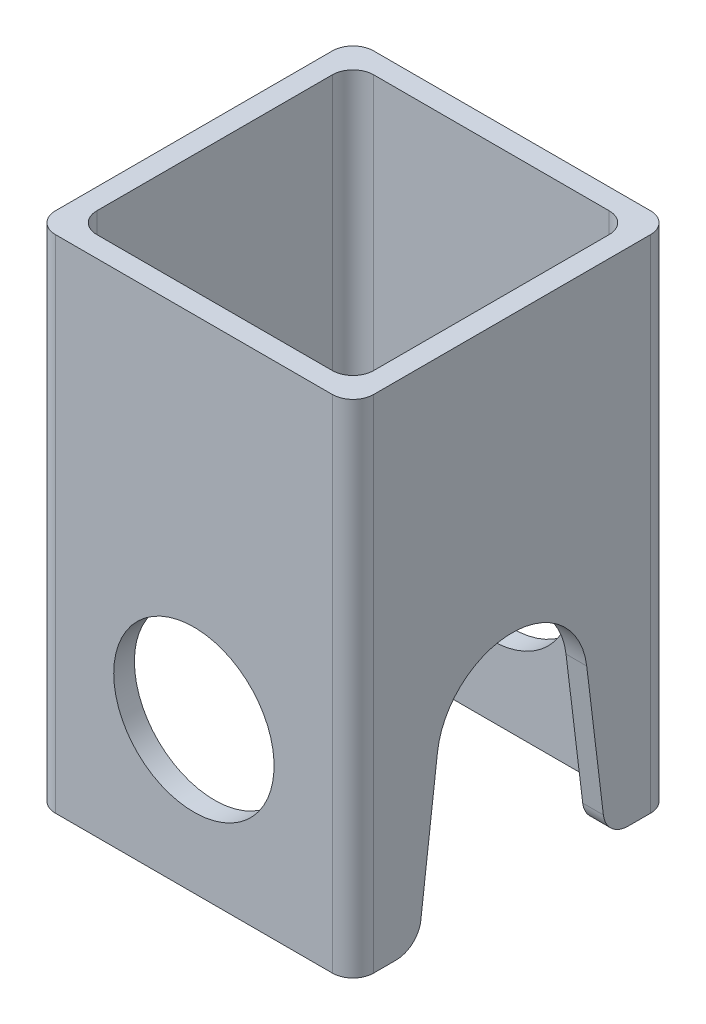
ISO-10303-21;
HEADER;
FILE_DESCRIPTION(('STEP AP214'),'2;1');
FILE_NAME('part.step','',(''),(''),'','','');
FILE_SCHEMA(('AUTOMOTIVE_DESIGN { 1 0 10303 214 1 1 1 1 }'));
ENDSEC;
DATA;
#1=APPLICATION_CONTEXT('core data for automotive mechanical design processes');
#2=APPLICATION_PROTOCOL_DEFINITION('international standard','automotive_design',2000,#1);
#3=PRODUCT_CONTEXT('',#1,'mechanical');
#4=PRODUCT('Part','Part','',(#3));
#5=PRODUCT_RELATED_PRODUCT_CATEGORY('part','',(#4));
#6=PRODUCT_DEFINITION_FORMATION('','',#4);
#7=PRODUCT_DEFINITION_CONTEXT('part definition',#1,'design');
#8=PRODUCT_DEFINITION('design','',#6,#7);
#9=PRODUCT_DEFINITION_SHAPE('','',#8);
#10=(LENGTH_UNIT() NAMED_UNIT(*) SI_UNIT(.MILLI.,.METRE.));
#11=(NAMED_UNIT(*) PLANE_ANGLE_UNIT() SI_UNIT($,.RADIAN.));
#12=(NAMED_UNIT(*) SI_UNIT($,.STERADIAN.) SOLID_ANGLE_UNIT());
#13=UNCERTAINTY_MEASURE_WITH_UNIT(LENGTH_MEASURE(1.E-05),#10,'distance_accuracy_value','');
#14=(GEOMETRIC_REPRESENTATION_CONTEXT(3) GLOBAL_UNCERTAINTY_ASSIGNED_CONTEXT((#13)) GLOBAL_UNIT_ASSIGNED_CONTEXT((#10,
#11,#12)) REPRESENTATION_CONTEXT('',''));
#15=CARTESIAN_POINT('',(0.,0.,0.));
#16=DIRECTION('',(0.,0.,1.));
#17=DIRECTION('',(1.,0.,0.));
#18=AXIS2_PLACEMENT_3D('',#15,#16,#17);
#19=CARTESIAN_POINT('',(-11.049,0.,-11.049));
#20=DIRECTION('',(0.,-1.,0.));
#21=DIRECTION('',(0.,0.,-1.));
#22=AXIS2_PLACEMENT_3D('',#19,#20,#21);
#23=PLANE('',#22);
#24=DIRECTION('',(0.,0.,1.));
#25=VECTOR('',#24,1.);
#26=CARTESIAN_POINT('',(-11.049,0.,-9.39799999999999));
#27=LINE('',#26,#25);
#28=CARTESIAN_POINT('',(-11.049,0.,-9.39799999999999));
#29=VERTEX_POINT('',#28);
#30=CARTESIAN_POINT('',(-11.049,0.,-9.27200187265877));
#31=VERTEX_POINT('',#30);
#32=EDGE_CURVE('E442',#29,#31,#27,.T.);
#33=ORIENTED_EDGE('',*,*,#32,.T.);
#34=DIRECTION('',(1.,0.,0.));
#35=VECTOR('',#34,1.);
#36=CARTESIAN_POINT('',(-12.7,0.,-9.27200187265877));
#37=LINE('',#36,#35);
#38=CARTESIAN_POINT('',(-12.7,0.,-9.27200187265877));
#39=VERTEX_POINT('',#38);
#40=EDGE_CURVE('E537',#31,#39,#37,.F.);
#41=ORIENTED_EDGE('',*,*,#40,.T.);
#42=DIRECTION('',(0.,0.,1.));
#43=VECTOR('',#42,1.);
#44=CARTESIAN_POINT('',(-12.7,0.,11.049));
#45=LINE('',#44,#43);
#46=CARTESIAN_POINT('',(-12.7,0.,-11.049));
#47=VERTEX_POINT('',#46);
#48=EDGE_CURVE('E406',#47,#39,#45,.T.);
#49=ORIENTED_EDGE('',*,*,#48,.F.);
#50=CARTESIAN_POINT('',(-11.049,0.,-11.049));
#51=DIRECTION('',(0.,1.,0.));
#52=DIRECTION('',(0.,0.,-1.));
#53=AXIS2_PLACEMENT_3D('',#50,#51,#52);
#54=CIRCLE('',#53,1.651);
#55=CARTESIAN_POINT('',(-11.049,0.,-12.7));
#56=VERTEX_POINT('',#55);
#57=EDGE_CURVE('E342',#56,#47,#54,.T.);
#58=ORIENTED_EDGE('',*,*,#57,.F.);
#59=DIRECTION('',(-1.,0.,0.));
#60=VECTOR('',#59,1.);
#61=CARTESIAN_POINT('',(11.049,0.,-12.7));
#62=LINE('',#61,#60);
#63=CARTESIAN_POINT('',(11.049,0.,-12.7));
#64=VERTEX_POINT('',#63);
#65=EDGE_CURVE('E426',#64,#56,#62,.T.);
#66=ORIENTED_EDGE('',*,*,#65,.F.);
#67=CARTESIAN_POINT('',(11.049,0.,-11.049));
#68=DIRECTION('',(0.,1.,0.));
#69=DIRECTION('',(0.,0.,1.));
#70=AXIS2_PLACEMENT_3D('',#67,#68,#69);
#71=CIRCLE('',#70,1.651);
#72=CARTESIAN_POINT('',(12.7,0.,-11.049));
#73=VERTEX_POINT('',#72);
#74=EDGE_CURVE('E423',#73,#64,#71,.T.);
#75=ORIENTED_EDGE('',*,*,#74,.F.);
#76=DIRECTION('',(0.,0.,-1.));
#77=VECTOR('',#76,1.);
#78=CARTESIAN_POINT('',(12.7,0.,11.049));
#79=LINE('',#78,#77);
#80=CARTESIAN_POINT('',(12.7,0.,-9.27200187265876));
#81=VERTEX_POINT('',#80);
#82=EDGE_CURVE('E418',#81,#73,#79,.T.);
#83=ORIENTED_EDGE('',*,*,#82,.F.);
#84=DIRECTION('',(1.,0.,0.));
#85=VECTOR('',#84,1.);
#86=CARTESIAN_POINT('',(11.049,0.,-9.27200187265876));
#87=LINE('',#86,#85);
#88=CARTESIAN_POINT('',(11.049,0.,-9.27200187265876));
#89=VERTEX_POINT('',#88);
#90=EDGE_CURVE('E534',#81,#89,#87,.F.);
#91=ORIENTED_EDGE('',*,*,#90,.T.);
#92=DIRECTION('',(0.,0.,-1.));
#93=VECTOR('',#92,1.);
#94=CARTESIAN_POINT('',(11.049,0.,-9.39799999999999));
#95=LINE('',#94,#93);
#96=CARTESIAN_POINT('',(11.049,0.,-9.39799999999999));
#97=VERTEX_POINT('',#96);
#98=EDGE_CURVE('E458',#89,#97,#95,.T.);
#99=ORIENTED_EDGE('',*,*,#98,.T.);
#100=CARTESIAN_POINT('',(9.39800000000001,0.,-9.398));
#101=DIRECTION('',(0.,1.,0.));
#102=DIRECTION('',(0.,0.,-1.));
#103=AXIS2_PLACEMENT_3D('',#100,#101,#102);
#104=CIRCLE('',#103,1.651);
#105=CARTESIAN_POINT('',(9.39799999999999,0.,-11.049));
#106=VERTEX_POINT('',#105);
#107=EDGE_CURVE('E454',#97,#106,#104,.T.);
#108=ORIENTED_EDGE('',*,*,#107,.T.);
#109=DIRECTION('',(-1.,0.,0.));
#110=VECTOR('',#109,1.);
#111=CARTESIAN_POINT('',(9.39799999999999,0.,-11.049));
#112=LINE('',#111,#110);
#113=CARTESIAN_POINT('',(-9.39799999999999,0.,-11.049));
#114=VERTEX_POINT('',#113);
#115=EDGE_CURVE('E450',#106,#114,#112,.T.);
#116=ORIENTED_EDGE('',*,*,#115,.T.);
#117=CARTESIAN_POINT('',(-9.39800000000001,0.,-9.398));
#118=DIRECTION('',(0.,1.,0.));
#119=DIRECTION('',(0.,0.,-1.));
#120=AXIS2_PLACEMENT_3D('',#117,#118,#119);
#121=CIRCLE('',#120,1.651);
#122=EDGE_CURVE('E446',#114,#29,#121,.T.);
#123=ORIENTED_EDGE('',*,*,#122,.T.);
#124=EDGE_LOOP('',(#33,#41,#49,#58,#66,#75,#83,#91,#99,#108,#116,#123));
#125=FACE_BOUND('',#124,.T.);
#126=ADVANCED_FACE('F73',(#125),#23,.T.);
#127=CARTESIAN_POINT('',(9.398,40.,9.398));
#128=DIRECTION('',(0.,-1.,0.));
#129=DIRECTION('',(0.,0.,-1.));
#130=AXIS2_PLACEMENT_3D('',#127,#128,#129);
#131=CYLINDRICAL_SURFACE('',#130,1.651);
#132=CARTESIAN_POINT('',(9.398,0.,9.398));
#133=DIRECTION('',(0.,1.,0.));
#134=DIRECTION('',(0.,0.,-1.));
#135=AXIS2_PLACEMENT_3D('',#132,#133,#134);
#136=CIRCLE('',#135,1.651);
#137=CARTESIAN_POINT('',(9.39799999999999,0.,11.049));
#138=VERTEX_POINT('',#137);
#139=CARTESIAN_POINT('',(11.049,0.,9.39799999999999));
#140=VERTEX_POINT('',#139);
#141=EDGE_CURVE('E429',#138,#140,#136,.T.);
#142=ORIENTED_EDGE('',*,*,#141,.F.);
#143=DIRECTION('',(0.,-1.,0.));
#144=VECTOR('',#143,1.);
#145=CARTESIAN_POINT('',(9.39799999999999,40.,11.049));
#146=LINE('',#145,#144);
#147=CARTESIAN_POINT('',(9.39799999999999,40.,11.049));
#148=VERTEX_POINT('',#147);
#149=EDGE_CURVE('E485',#148,#138,#146,.T.);
#150=ORIENTED_EDGE('',*,*,#149,.F.);
#151=CARTESIAN_POINT('',(9.398,40.,9.398));
#152=DIRECTION('',(0.,1.,0.));
#153=DIRECTION('',(0.,0.,-1.));
#154=AXIS2_PLACEMENT_3D('',#151,#152,#153);
#155=CIRCLE('',#154,1.651);
#156=CARTESIAN_POINT('',(11.049,40.,9.39799999999999));
#157=VERTEX_POINT('',#156);
#158=EDGE_CURVE('E369',#148,#157,#155,.T.);
#159=ORIENTED_EDGE('',*,*,#158,.T.);
#160=DIRECTION('',(0.,-1.,0.));
#161=VECTOR('',#160,1.);
#162=CARTESIAN_POINT('',(11.049,40.,9.39799999999999));
#163=LINE('',#162,#161);
#164=EDGE_CURVE('E461',#157,#140,#163,.T.);
#165=ORIENTED_EDGE('',*,*,#164,.T.);
#166=EDGE_LOOP('',(#142,#150,#159,#165));
#167=FACE_BOUND('',#166,.T.);
#168=ADVANCED_FACE('F657',(#167),#131,.F.);
#169=CARTESIAN_POINT('',(9.39799999999999,40.,11.049));
#170=DIRECTION('',(0.,0.,-1.));
#171=DIRECTION('',(-1.,0.,0.));
#172=AXIS2_PLACEMENT_3D('',#169,#170,#171);
#173=PLANE('',#172);
#174=CARTESIAN_POINT('',(0.,12.,11.049));
#175=DIRECTION('',(0.,0.,-1.));
#176=DIRECTION('',(-1.,0.,0.));
#177=AXIS2_PLACEMENT_3D('',#174,#175,#176);
#178=CIRCLE('',#177,6.4);
#179=CARTESIAN_POINT('',(-6.4,12.,11.049));
#180=VERTEX_POINT('',#179);
#181=EDGE_CURVE('E338',#180,#180,#178,.T.);
#182=ORIENTED_EDGE('',*,*,#181,.F.);
#183=EDGE_LOOP('',(#182));
#184=FACE_BOUND('',#183,.T.);
#185=DIRECTION('',(1.,0.,0.));
#186=VECTOR('',#185,1.);
#187=CARTESIAN_POINT('',(9.39799999999999,0.,11.049));
#188=LINE('',#187,#186);
#189=CARTESIAN_POINT('',(-9.39799999999999,0.,11.049));
#190=VERTEX_POINT('',#189);
#191=EDGE_CURVE('E433',#190,#138,#188,.T.);
#192=ORIENTED_EDGE('',*,*,#191,.F.);
#193=DIRECTION('',(0.,-1.,0.));
#194=VECTOR('',#193,1.);
#195=CARTESIAN_POINT('',(-9.39799999999999,40.,11.049));
#196=LINE('',#195,#194);
#197=CARTESIAN_POINT('',(-9.39799999999999,40.,11.049));
#198=VERTEX_POINT('',#197);
#199=EDGE_CURVE('E482',#198,#190,#196,.T.);
#200=ORIENTED_EDGE('',*,*,#199,.F.);
#201=DIRECTION('',(1.,0.,0.));
#202=VECTOR('',#201,1.);
#203=CARTESIAN_POINT('',(9.39799999999999,40.,11.049));
#204=LINE('',#203,#202);
#205=EDGE_CURVE('E373',#198,#148,#204,.T.);
#206=ORIENTED_EDGE('',*,*,#205,.T.);
#207=ORIENTED_EDGE('',*,*,#149,.T.);
#208=EDGE_LOOP('',(#192,#200,#206,#207));
#209=FACE_BOUND('',#208,.T.);
#210=ADVANCED_FACE('F653',(#184,#209),#173,.T.);
#211=CARTESIAN_POINT('',(-9.398,40.,9.398));
#212=DIRECTION('',(0.,-1.,0.));
#213=DIRECTION('',(0.,0.,-1.));
#214=AXIS2_PLACEMENT_3D('',#211,#212,#213);
#215=CYLINDRICAL_SURFACE('',#214,1.651);
#216=CARTESIAN_POINT('',(-9.398,0.,9.398));
#217=DIRECTION('',(0.,1.,0.));
#218=DIRECTION('',(0.,0.,-1.));
#219=AXIS2_PLACEMENT_3D('',#216,#217,#218);
#220=CIRCLE('',#219,1.651);
#221=CARTESIAN_POINT('',(-11.049,0.,9.39799999999999));
#222=VERTEX_POINT('',#221);
#223=EDGE_CURVE('E437',#222,#190,#220,.T.);
#224=ORIENTED_EDGE('',*,*,#223,.F.);
#225=DIRECTION('',(0.,-1.,0.));
#226=VECTOR('',#225,1.);
#227=CARTESIAN_POINT('',(-11.049,40.,9.39799999999999));
#228=LINE('',#227,#226);
#229=CARTESIAN_POINT('',(-11.049,40.,9.39799999999999));
#230=VERTEX_POINT('',#229);
#231=EDGE_CURVE('E478',#230,#222,#228,.T.);
#232=ORIENTED_EDGE('',*,*,#231,.F.);
#233=CARTESIAN_POINT('',(-9.398,40.,9.398));
#234=DIRECTION('',(0.,1.,0.));
#235=DIRECTION('',(0.,0.,-1.));
#236=AXIS2_PLACEMENT_3D('',#233,#234,#235);
#237=CIRCLE('',#236,1.651);
#238=EDGE_CURVE('E377',#230,#198,#237,.T.);
#239=ORIENTED_EDGE('',*,*,#238,.T.);
#240=ORIENTED_EDGE('',*,*,#199,.T.);
#241=EDGE_LOOP('',(#224,#232,#239,#240));
#242=FACE_BOUND('',#241,.T.);
#243=ADVANCED_FACE('F649',(#242),#215,.F.);
#244=CARTESIAN_POINT('',(-11.049,40.,-9.39799999999999));
#245=DIRECTION('',(1.,0.,0.));
#246=DIRECTION('',(0.,0.,-1.));
#247=AXIS2_PLACEMENT_3D('',#244,#245,#246);
#248=PLANE('',#247);
#249=DIRECTION('',(0.,0.992719437781351,0.120449648613344));
#250=VECTOR('',#249,1.);
#251=CARTESIAN_POINT('',(-11.049,39.1927262872122,-2.74462810958533));
#252=LINE('',#251,#250);
#253=CARTESIAN_POINT('',(-11.049,1.7591007027733,-7.28656299709607));
#254=VERTEX_POINT('',#253);
#255=CARTESIAN_POINT('',(-11.049,12.7226978916801,-5.95631662668811));
#256=VERTEX_POINT('',#255);
#257=EDGE_CURVE('E320',#254,#256,#252,.T.);
#258=ORIENTED_EDGE('',*,*,#257,.F.);
#259=CARTESIAN_POINT('',(-11.049,2.,-9.27200187265877));
#260=DIRECTION('',(1.,0.,0.));
#261=DIRECTION('',(0.,0.,-1.));
#262=AXIS2_PLACEMENT_3D('',#259,#260,#261);
#263=CIRCLE('',#262,2.);
#264=EDGE_CURVE('E531',#254,#31,#263,.T.);
#265=ORIENTED_EDGE('',*,*,#264,.T.);
#266=ORIENTED_EDGE('',*,*,#32,.F.);
#267=DIRECTION('',(0.,-1.,0.));
#268=VECTOR('',#267,1.);
#269=CARTESIAN_POINT('',(-11.049,40.,-9.39799999999999));
#270=LINE('',#269,#268);
#271=CARTESIAN_POINT('',(-11.049,40.,-9.39799999999999));
#272=VERTEX_POINT('',#271);
#273=EDGE_CURVE('E475',#272,#29,#270,.T.);
#274=ORIENTED_EDGE('',*,*,#273,.F.);
#275=DIRECTION('',(0.,0.,1.));
#276=VECTOR('',#275,1.);
#277=CARTESIAN_POINT('',(-11.049,40.,-9.39799999999999));
#278=LINE('',#277,#276);
#279=EDGE_CURVE('E381',#272,#230,#278,.T.);
#280=ORIENTED_EDGE('',*,*,#279,.T.);
#281=ORIENTED_EDGE('',*,*,#231,.T.);
#282=CARTESIAN_POINT('',(-11.049,0.,9.27200187265876));
#283=VERTEX_POINT('',#282);
#284=EDGE_CURVE('E441',#283,#222,#27,.T.);
#285=ORIENTED_EDGE('',*,*,#284,.F.);
#286=CARTESIAN_POINT('',(-11.049,2.,9.27200187265877));
#287=DIRECTION('',(1.,0.,0.));
#288=DIRECTION('',(0.,0.,-1.));
#289=AXIS2_PLACEMENT_3D('',#286,#287,#288);
#290=CIRCLE('',#289,2.);
#291=CARTESIAN_POINT('',(-11.049,1.7591007027733,7.28656299709606));
#292=VERTEX_POINT('',#291);
#293=EDGE_CURVE('E528',#283,#292,#290,.T.);
#294=ORIENTED_EDGE('',*,*,#293,.T.);
#295=DIRECTION('',(0.,-0.992719437781351,0.120449648613344));
#296=VECTOR('',#295,1.);
#297=CARTESIAN_POINT('',(-11.049,41.4402148964875,2.47193352645646));
#298=LINE('',#297,#296);
#299=CARTESIAN_POINT('',(-11.049,12.7226978916801,5.9563166266881));
#300=VERTEX_POINT('',#299);
#301=EDGE_CURVE('E309',#300,#292,#298,.T.);
#302=ORIENTED_EDGE('',*,*,#301,.F.);
#303=CARTESIAN_POINT('',(-11.049,12.,0.));
#304=DIRECTION('',(1.,0.,0.));
#305=DIRECTION('',(0.,0.,-1.));
#306=AXIS2_PLACEMENT_3D('',#303,#304,#305);
#307=CIRCLE('',#306,6.);
#308=EDGE_CURVE('E266',#256,#300,#307,.T.);
#309=ORIENTED_EDGE('',*,*,#308,.F.);
#310=EDGE_LOOP('',(#258,#265,#266,#274,#280,#281,#285,#294,#302,#309));
#311=FACE_BOUND('',#310,.T.);
#312=ADVANCED_FACE('F642',(#311),#248,.T.);
#313=CARTESIAN_POINT('',(-9.39800000000001,40.,-9.398));
#314=DIRECTION('',(0.,-1.,0.));
#315=DIRECTION('',(0.,0.,-1.));
#316=AXIS2_PLACEMENT_3D('',#313,#314,#315);
#317=CYLINDRICAL_SURFACE('',#316,1.651);
#318=ORIENTED_EDGE('',*,*,#122,.F.);
#319=DIRECTION('',(0.,-1.,0.));
#320=VECTOR('',#319,1.);
#321=CARTESIAN_POINT('',(-9.39799999999999,40.,-11.049));
#322=LINE('',#321,#320);
#323=CARTESIAN_POINT('',(-9.39799999999999,40.,-11.049));
#324=VERTEX_POINT('',#323);
#325=EDGE_CURVE('E472',#324,#114,#322,.T.);
#326=ORIENTED_EDGE('',*,*,#325,.F.);
#327=CARTESIAN_POINT('',(-9.39800000000001,40.,-9.398));
#328=DIRECTION('',(0.,1.,0.));
#329=DIRECTION('',(0.,0.,-1.));
#330=AXIS2_PLACEMENT_3D('',#327,#328,#329);
#331=CIRCLE('',#330,1.651);
#332=EDGE_CURVE('E385',#324,#272,#331,.T.);
#333=ORIENTED_EDGE('',*,*,#332,.T.);
#334=ORIENTED_EDGE('',*,*,#273,.T.);
#335=EDGE_LOOP('',(#318,#326,#333,#334));
#336=FACE_BOUND('',#335,.T.);
#337=ADVANCED_FACE('F669',(#336),#317,.F.);
#338=CARTESIAN_POINT('',(9.39799999999999,40.,-11.049));
#339=DIRECTION('',(0.,0.,1.));
#340=DIRECTION('',(1.,0.,0.));
#341=AXIS2_PLACEMENT_3D('',#338,#339,#340);
#342=PLANE('',#341);
#343=CARTESIAN_POINT('',(0.,12.,-11.049));
#344=DIRECTION('',(0.,0.,1.));
#345=DIRECTION('',(1.,0.,0.));
#346=AXIS2_PLACEMENT_3D('',#343,#344,#345);
#347=CIRCLE('',#346,6.4);
#348=CARTESIAN_POINT('',(6.4,12.,-11.049));
#349=VERTEX_POINT('',#348);
#350=EDGE_CURVE('E334',#349,#349,#347,.T.);
#351=ORIENTED_EDGE('',*,*,#350,.F.);
#352=EDGE_LOOP('',(#351));
#353=FACE_BOUND('',#352,.T.);
#354=ORIENTED_EDGE('',*,*,#115,.F.);
#355=DIRECTION('',(0.,-1.,0.));
#356=VECTOR('',#355,1.);
#357=CARTESIAN_POINT('',(9.39799999999999,40.,-11.049));
#358=LINE('',#357,#356);
#359=CARTESIAN_POINT('',(9.39799999999999,40.,-11.049));
#360=VERTEX_POINT('',#359);
#361=EDGE_CURVE('E469',#360,#106,#358,.T.);
#362=ORIENTED_EDGE('',*,*,#361,.F.);
#363=DIRECTION('',(-1.,0.,0.));
#364=VECTOR('',#363,1.);
#365=CARTESIAN_POINT('',(9.39799999999999,40.,-11.049));
#366=LINE('',#365,#364);
#367=EDGE_CURVE('E389',#360,#324,#366,.T.);
#368=ORIENTED_EDGE('',*,*,#367,.T.);
#369=ORIENTED_EDGE('',*,*,#325,.T.);
#370=EDGE_LOOP('',(#354,#362,#368,#369));
#371=FACE_BOUND('',#370,.T.);
#372=ADVANCED_FACE('F667',(#353,#371),#342,.T.);
#373=CARTESIAN_POINT('',(9.39800000000001,40.,-9.398));
#374=DIRECTION('',(0.,-1.,0.));
#375=DIRECTION('',(0.,0.,-1.));
#376=AXIS2_PLACEMENT_3D('',#373,#374,#375);
#377=CYLINDRICAL_SURFACE('',#376,1.651);
#378=ORIENTED_EDGE('',*,*,#107,.F.);
#379=DIRECTION('',(0.,-1.,0.));
#380=VECTOR('',#379,1.);
#381=CARTESIAN_POINT('',(11.049,40.,-9.39799999999999));
#382=LINE('',#381,#380);
#383=CARTESIAN_POINT('',(11.049,40.,-9.39799999999999));
#384=VERTEX_POINT('',#383);
#385=EDGE_CURVE('E464',#384,#97,#382,.T.);
#386=ORIENTED_EDGE('',*,*,#385,.F.);
#387=CARTESIAN_POINT('',(9.39800000000001,40.,-9.398));
#388=DIRECTION('',(0.,1.,0.));
#389=DIRECTION('',(0.,0.,-1.));
#390=AXIS2_PLACEMENT_3D('',#387,#388,#389);
#391=CIRCLE('',#390,1.651);
#392=EDGE_CURVE('E393',#384,#360,#391,.T.);
#393=ORIENTED_EDGE('',*,*,#392,.T.);
#394=ORIENTED_EDGE('',*,*,#361,.T.);
#395=EDGE_LOOP('',(#378,#386,#393,#394));
#396=FACE_BOUND('',#395,.T.);
#397=ADVANCED_FACE('F663',(#396),#377,.F.);
#398=CARTESIAN_POINT('',(-11.049,40.,-11.049));
#399=DIRECTION('',(0.,-1.,0.));
#400=DIRECTION('',(0.,0.,-1.));
#401=AXIS2_PLACEMENT_3D('',#398,#399,#400);
#402=CYLINDRICAL_SURFACE('',#401,1.651);
#403=ORIENTED_EDGE('',*,*,#57,.T.);
#404=DIRECTION('',(0.,-1.,0.));
#405=VECTOR('',#404,1.);
#406=CARTESIAN_POINT('',(-12.7,40.,-11.049));
#407=LINE('',#406,#405);
#408=CARTESIAN_POINT('',(-12.7,40.,-11.049));
#409=VERTEX_POINT('',#408);
#410=EDGE_CURVE('E465',#409,#47,#407,.T.);
#411=ORIENTED_EDGE('',*,*,#410,.F.);
#412=CARTESIAN_POINT('',(-11.049,40.,-11.049));
#413=DIRECTION('',(0.,1.,0.));
#414=DIRECTION('',(0.,0.,-1.));
#415=AXIS2_PLACEMENT_3D('',#412,#413,#414);
#416=CIRCLE('',#415,1.651);
#417=CARTESIAN_POINT('',(-11.049,40.,-12.7));
#418=VERTEX_POINT('',#417);
#419=EDGE_CURVE('E343',#418,#409,#416,.T.);
#420=ORIENTED_EDGE('',*,*,#419,.F.);
#421=DIRECTION('',(0.,-1.,0.));
#422=VECTOR('',#421,1.);
#423=CARTESIAN_POINT('',(-11.049,40.,-12.7));
#424=LINE('',#423,#422);
#425=EDGE_CURVE('E401',#418,#56,#424,.T.);
#426=ORIENTED_EDGE('',*,*,#425,.T.);
#427=EDGE_LOOP('',(#403,#411,#420,#426));
#428=FACE_BOUND('',#427,.T.);
#429=ADVANCED_FACE('F631',(#428),#402,.T.);
#430=CARTESIAN_POINT('',(-12.7,40.,11.049));
#431=DIRECTION('',(1.,0.,0.));
#432=DIRECTION('',(0.,0.,-1.));
#433=AXIS2_PLACEMENT_3D('',#430,#431,#432);
#434=PLANE('',#433);
#435=ORIENTED_EDGE('',*,*,#48,.T.);
#436=CARTESIAN_POINT('',(-12.7,2.,-9.27200187265877));
#437=DIRECTION('',(1.,0.,0.));
#438=DIRECTION('',(0.,0.,-1.));
#439=AXIS2_PLACEMENT_3D('',#436,#437,#438);
#440=CIRCLE('',#439,2.);
#441=CARTESIAN_POINT('',(-12.7,1.75910070277331,-7.28656299709607));
#442=VERTEX_POINT('',#441);
#443=EDGE_CURVE('E543',#39,#442,#440,.F.);
#444=ORIENTED_EDGE('',*,*,#443,.T.);
#445=DIRECTION('',(0.,0.992719437781351,0.120449648613344));
#446=VECTOR('',#445,1.);
#447=CARTESIAN_POINT('',(-12.7,12.7226978916801,-5.95631662668811));
#448=LINE('',#447,#446);
#449=CARTESIAN_POINT('',(-12.7,12.7226978916801,-5.95631662668811));
#450=VERTEX_POINT('',#449);
#451=EDGE_CURVE('E281',#442,#450,#448,.T.);
#452=ORIENTED_EDGE('',*,*,#451,.T.);
#453=CARTESIAN_POINT('',(-12.7,12.,0.));
#454=DIRECTION('',(1.,0.,0.));
#455=DIRECTION('',(0.,0.,1.));
#456=AXIS2_PLACEMENT_3D('',#453,#454,#455);
#457=CIRCLE('',#456,6.);
#458=CARTESIAN_POINT('',(-12.7,12.7226978916801,5.95631662668811));
#459=VERTEX_POINT('',#458);
#460=EDGE_CURVE('E264',#450,#459,#457,.T.);
#461=ORIENTED_EDGE('',*,*,#460,.T.);
#462=DIRECTION('',(0.,-0.992719437781351,0.120449648613344));
#463=VECTOR('',#462,1.);
#464=CARTESIAN_POINT('',(-12.7,12.7226978916801,5.95631662668811));
#465=LINE('',#464,#463);
#466=CARTESIAN_POINT('',(-12.7,1.75910070277331,7.28656299709606));
#467=VERTEX_POINT('',#466);
#468=EDGE_CURVE('E275',#459,#467,#465,.T.);
#469=ORIENTED_EDGE('',*,*,#468,.T.);
#470=CARTESIAN_POINT('',(-12.7,2.,9.27200187265877));
#471=DIRECTION('',(1.,0.,0.));
#472=DIRECTION('',(0.,0.,-1.));
#473=AXIS2_PLACEMENT_3D('',#470,#471,#472);
#474=CIRCLE('',#473,2.);
#475=CARTESIAN_POINT('',(-12.7,0.,9.27200187265877));
#476=VERTEX_POINT('',#475);
#477=EDGE_CURVE('E540',#467,#476,#474,.F.);
#478=ORIENTED_EDGE('',*,*,#477,.T.);
#479=CARTESIAN_POINT('',(-12.7,0.,11.049));
#480=VERTEX_POINT('',#479);
#481=EDGE_CURVE('E405',#476,#480,#45,.T.);
#482=ORIENTED_EDGE('',*,*,#481,.T.);
#483=DIRECTION('',(0.,-1.,0.));
#484=VECTOR('',#483,1.);
#485=CARTESIAN_POINT('',(-12.7,40.,11.049));
#486=LINE('',#485,#484);
#487=CARTESIAN_POINT('',(-12.7,40.,11.049));
#488=VERTEX_POINT('',#487);
#489=EDGE_CURVE('E512',#488,#480,#486,.T.);
#490=ORIENTED_EDGE('',*,*,#489,.F.);
#491=DIRECTION('',(0.,0.,1.));
#492=VECTOR('',#491,1.);
#493=CARTESIAN_POINT('',(-12.7,40.,11.049));
#494=LINE('',#493,#492);
#495=EDGE_CURVE('E347',#409,#488,#494,.T.);
#496=ORIENTED_EDGE('',*,*,#495,.F.);
#497=ORIENTED_EDGE('',*,*,#410,.T.);
#498=EDGE_LOOP('',(#435,#444,#452,#461,#469,#478,#482,#490,#496,#497));
#499=FACE_BOUND('',#498,.T.);
#500=ADVANCED_FACE('F284',(#499),#434,.F.);
#501=CARTESIAN_POINT('',(-11.049,40.,11.049));
#502=DIRECTION('',(0.,-1.,0.));
#503=DIRECTION('',(0.,0.,-1.));
#504=AXIS2_PLACEMENT_3D('',#501,#502,#503);
#505=CYLINDRICAL_SURFACE('',#504,1.651);
#506=CARTESIAN_POINT('',(-11.049,0.,11.049));
#507=DIRECTION('',(0.,1.,0.));
#508=DIRECTION('',(0.,0.,-1.));
#509=AXIS2_PLACEMENT_3D('',#506,#507,#508);
#510=CIRCLE('',#509,1.651);
#511=CARTESIAN_POINT('',(-11.049,0.,12.7));
#512=VERTEX_POINT('',#511);
#513=EDGE_CURVE('E409',#480,#512,#510,.T.);
#514=ORIENTED_EDGE('',*,*,#513,.T.);
#515=DIRECTION('',(0.,-1.,0.));
#516=VECTOR('',#515,1.);
#517=CARTESIAN_POINT('',(-11.049,40.,12.7));
#518=LINE('',#517,#516);
#519=CARTESIAN_POINT('',(-11.049,40.,12.7));
#520=VERTEX_POINT('',#519);
#521=EDGE_CURVE('E508',#520,#512,#518,.T.);
#522=ORIENTED_EDGE('',*,*,#521,.F.);
#523=CARTESIAN_POINT('',(-11.049,40.,11.049));
#524=DIRECTION('',(0.,1.,0.));
#525=DIRECTION('',(0.,0.,-1.));
#526=AXIS2_PLACEMENT_3D('',#523,#524,#525);
#527=CIRCLE('',#526,1.651);
#528=EDGE_CURVE('E351',#488,#520,#527,.T.);
#529=ORIENTED_EDGE('',*,*,#528,.F.);
#530=ORIENTED_EDGE('',*,*,#489,.T.);
#531=EDGE_LOOP('',(#514,#522,#529,#530));
#532=FACE_BOUND('',#531,.T.);
#533=ADVANCED_FACE('F613',(#532),#505,.T.);
#534=CARTESIAN_POINT('',(11.049,40.,12.7));
#535=DIRECTION('',(0.,0.,-1.));
#536=DIRECTION('',(-1.,0.,0.));
#537=AXIS2_PLACEMENT_3D('',#534,#535,#536);
#538=PLANE('',#537);
#539=CARTESIAN_POINT('',(0.,12.,12.7));
#540=DIRECTION('',(0.,0.,-1.));
#541=DIRECTION('',(-1.,0.,0.));
#542=AXIS2_PLACEMENT_3D('',#539,#540,#541);
#543=CIRCLE('',#542,6.4);
#544=CARTESIAN_POINT('',(-6.4,12.,12.7));
#545=VERTEX_POINT('',#544);
#546=EDGE_CURVE('E330',#545,#545,#543,.T.);
#547=ORIENTED_EDGE('',*,*,#546,.T.);
#548=EDGE_LOOP('',(#547));
#549=FACE_BOUND('',#548,.T.);
#550=DIRECTION('',(1.,0.,0.));
#551=VECTOR('',#550,1.);
#552=CARTESIAN_POINT('',(11.049,0.,12.7));
#553=LINE('',#552,#551);
#554=CARTESIAN_POINT('',(11.049,0.,12.7));
#555=VERTEX_POINT('',#554);
#556=EDGE_CURVE('E412',#512,#555,#553,.T.);
#557=ORIENTED_EDGE('',*,*,#556,.T.);
#558=DIRECTION('',(0.,-1.,0.));
#559=VECTOR('',#558,1.);
#560=CARTESIAN_POINT('',(11.049,40.,12.7));
#561=LINE('',#560,#559);
#562=CARTESIAN_POINT('',(11.049,40.,12.7));
#563=VERTEX_POINT('',#562);
#564=EDGE_CURVE('E504',#563,#555,#561,.T.);
#565=ORIENTED_EDGE('',*,*,#564,.F.);
#566=DIRECTION('',(1.,0.,0.));
#567=VECTOR('',#566,1.);
#568=CARTESIAN_POINT('',(11.049,40.,12.7));
#569=LINE('',#568,#567);
#570=EDGE_CURVE('E354',#520,#563,#569,.T.);
#571=ORIENTED_EDGE('',*,*,#570,.F.);
#572=ORIENTED_EDGE('',*,*,#521,.T.);
#573=EDGE_LOOP('',(#557,#565,#571,#572));
#574=FACE_BOUND('',#573,.T.);
#575=ADVANCED_FACE('F618',(#549,#574),#538,.F.);
#576=CARTESIAN_POINT('',(11.049,40.,11.049));
#577=DIRECTION('',(0.,-1.,0.));
#578=DIRECTION('',(0.,0.,-1.));
#579=AXIS2_PLACEMENT_3D('',#576,#577,#578);
#580=CYLINDRICAL_SURFACE('',#579,1.651);
#581=CARTESIAN_POINT('',(11.049,0.,11.049));
#582=DIRECTION('',(0.,1.,0.));
#583=DIRECTION('',(0.,0.,-1.));
#584=AXIS2_PLACEMENT_3D('',#581,#582,#583);
#585=CIRCLE('',#584,1.651);
#586=CARTESIAN_POINT('',(12.7,0.,11.049));
#587=VERTEX_POINT('',#586);
#588=EDGE_CURVE('E415',#555,#587,#585,.T.);
#589=ORIENTED_EDGE('',*,*,#588,.T.);
#590=DIRECTION('',(0.,-1.,0.));
#591=VECTOR('',#590,1.);
#592=CARTESIAN_POINT('',(12.7,40.,11.049));
#593=LINE('',#592,#591);
#594=CARTESIAN_POINT('',(12.7,40.,11.049));
#595=VERTEX_POINT('',#594);
#596=EDGE_CURVE('E500',#595,#587,#593,.T.);
#597=ORIENTED_EDGE('',*,*,#596,.F.);
#598=CARTESIAN_POINT('',(11.049,40.,11.049));
#599=DIRECTION('',(0.,1.,0.));
#600=DIRECTION('',(0.,0.,-1.));
#601=AXIS2_PLACEMENT_3D('',#598,#599,#600);
#602=CIRCLE('',#601,1.651);
#603=EDGE_CURVE('E357',#563,#595,#602,.T.);
#604=ORIENTED_EDGE('',*,*,#603,.F.);
#605=ORIENTED_EDGE('',*,*,#564,.T.);
#606=EDGE_LOOP('',(#589,#597,#604,#605));
#607=FACE_BOUND('',#606,.T.);
#608=ADVANCED_FACE('F622',(#607),#580,.T.);
#609=CARTESIAN_POINT('',(12.7,40.,11.049));
#610=DIRECTION('',(-1.,0.,0.));
#611=DIRECTION('',(0.,0.,1.));
#612=AXIS2_PLACEMENT_3D('',#609,#610,#611);
#613=PLANE('',#612);
#614=DIRECTION('',(0.,-0.992719437781351,-0.120449648613344));
#615=VECTOR('',#614,1.);
#616=CARTESIAN_POINT('',(12.7,41.6376294364915,-2.44798062388433));
#617=LINE('',#616,#615);
#618=CARTESIAN_POINT('',(12.7,12.7226978916801,-5.95631662668811));
#619=VERTEX_POINT('',#618);
#620=CARTESIAN_POINT('',(12.7,1.7591007027733,-7.28656299709606));
#621=VERTEX_POINT('',#620);
#622=EDGE_CURVE('E316',#619,#621,#617,.T.);
#623=ORIENTED_EDGE('',*,*,#622,.T.);
#624=CARTESIAN_POINT('',(12.7,2.,-9.27200187265876));
#625=DIRECTION('',(-1.,0.,0.));
#626=DIRECTION('',(0.,0.,1.));
#627=AXIS2_PLACEMENT_3D('',#624,#625,#626);
#628=CIRCLE('',#627,2.);
#629=EDGE_CURVE('E553',#621,#81,#628,.F.);
#630=ORIENTED_EDGE('',*,*,#629,.T.);
#631=ORIENTED_EDGE('',*,*,#82,.T.);
#632=DIRECTION('',(0.,-1.,0.));
#633=VECTOR('',#632,1.);
#634=CARTESIAN_POINT('',(12.7,40.,-11.049));
#635=LINE('',#634,#633);
#636=CARTESIAN_POINT('',(12.7,40.,-11.049));
#637=VERTEX_POINT('',#636);
#638=EDGE_CURVE('E496',#637,#73,#635,.T.);
#639=ORIENTED_EDGE('',*,*,#638,.F.);
#640=DIRECTION('',(0.,0.,-1.));
#641=VECTOR('',#640,1.);
#642=CARTESIAN_POINT('',(12.7,40.,11.049));
#643=LINE('',#642,#641);
#644=EDGE_CURVE('E360',#595,#637,#643,.T.);
#645=ORIENTED_EDGE('',*,*,#644,.F.);
#646=ORIENTED_EDGE('',*,*,#596,.T.);
#647=CARTESIAN_POINT('',(12.7,0.,9.27200187265877));
#648=VERTEX_POINT('',#647);
#649=EDGE_CURVE('E419',#587,#648,#79,.T.);
#650=ORIENTED_EDGE('',*,*,#649,.T.);
#651=CARTESIAN_POINT('',(12.7,2.,9.27200187265877));
#652=DIRECTION('',(-1.,0.,0.));
#653=DIRECTION('',(0.,0.,1.));
#654=AXIS2_PLACEMENT_3D('',#651,#652,#653);
#655=CIRCLE('',#654,2.);
#656=CARTESIAN_POINT('',(12.7,1.7591007027733,7.28656299709607));
#657=VERTEX_POINT('',#656);
#658=EDGE_CURVE('E550',#648,#657,#655,.F.);
#659=ORIENTED_EDGE('',*,*,#658,.T.);
#660=DIRECTION('',(0.,0.992719437781351,-0.120449648613344));
#661=VECTOR('',#660,1.);
#662=CARTESIAN_POINT('',(12.7,38.9953117472083,2.76858101215746));
#663=LINE('',#662,#661);
#664=CARTESIAN_POINT('',(12.7,12.7226978916801,5.95631662668811));
#665=VERTEX_POINT('',#664);
#666=EDGE_CURVE('E306',#657,#665,#663,.T.);
#667=ORIENTED_EDGE('',*,*,#666,.T.);
#668=CARTESIAN_POINT('',(12.7,12.,0.));
#669=DIRECTION('',(1.,0.,0.));
#670=DIRECTION('',(0.,0.,-1.));
#671=AXIS2_PLACEMENT_3D('',#668,#669,#670);
#672=CIRCLE('',#671,6.);
#673=EDGE_CURVE('E323',#619,#665,#672,.T.);
#674=ORIENTED_EDGE('',*,*,#673,.F.);
#675=EDGE_LOOP('',(#623,#630,#631,#639,#645,#646,#650,#659,#667,#674));
#676=FACE_BOUND('',#675,.T.);
#677=ADVANCED_FACE('F574',(#676),#613,.F.);
#678=CARTESIAN_POINT('',(11.049,40.,-11.049));
#679=DIRECTION('',(0.,-1.,0.));
#680=DIRECTION('',(0.,0.,-1.));
#681=AXIS2_PLACEMENT_3D('',#678,#679,#680);
#682=CYLINDRICAL_SURFACE('',#681,1.651);
#683=ORIENTED_EDGE('',*,*,#74,.T.);
#684=DIRECTION('',(0.,-1.,0.));
#685=VECTOR('',#684,1.);
#686=CARTESIAN_POINT('',(11.049,40.,-12.7));
#687=LINE('',#686,#685);
#688=CARTESIAN_POINT('',(11.049,40.,-12.7));
#689=VERTEX_POINT('',#688);
#690=EDGE_CURVE('E492',#689,#64,#687,.T.);
#691=ORIENTED_EDGE('',*,*,#690,.F.);
#692=CARTESIAN_POINT('',(11.049,40.,-11.049));
#693=DIRECTION('',(0.,1.,0.));
#694=DIRECTION('',(0.,0.,1.));
#695=AXIS2_PLACEMENT_3D('',#692,#693,#694);
#696=CIRCLE('',#695,1.651);
#697=EDGE_CURVE('E363',#637,#689,#696,.T.);
#698=ORIENTED_EDGE('',*,*,#697,.F.);
#699=ORIENTED_EDGE('',*,*,#638,.T.);
#700=EDGE_LOOP('',(#683,#691,#698,#699));
#701=FACE_BOUND('',#700,.T.);
#702=ADVANCED_FACE('F800',(#701),#682,.T.);
#703=CARTESIAN_POINT('',(11.049,40.,-12.7));
#704=DIRECTION('',(0.,0.,1.));
#705=DIRECTION('',(1.,0.,0.));
#706=AXIS2_PLACEMENT_3D('',#703,#704,#705);
#707=PLANE('',#706);
#708=CARTESIAN_POINT('',(0.,12.,-12.7));
#709=DIRECTION('',(0.,0.,1.));
#710=DIRECTION('',(1.,0.,0.));
#711=AXIS2_PLACEMENT_3D('',#708,#709,#710);
#712=CIRCLE('',#711,6.4);
#713=CARTESIAN_POINT('',(6.4,12.,-12.7));
#714=VERTEX_POINT('',#713);
#715=EDGE_CURVE('E326',#714,#714,#712,.T.);
#716=ORIENTED_EDGE('',*,*,#715,.T.);
#717=EDGE_LOOP('',(#716));
#718=FACE_BOUND('',#717,.T.);
#719=ORIENTED_EDGE('',*,*,#65,.T.);
#720=ORIENTED_EDGE('',*,*,#425,.F.);
#721=DIRECTION('',(-1.,0.,0.));
#722=VECTOR('',#721,1.);
#723=CARTESIAN_POINT('',(11.049,40.,-12.7));
#724=LINE('',#723,#722);
#725=EDGE_CURVE('E366',#689,#418,#724,.T.);
#726=ORIENTED_EDGE('',*,*,#725,.F.);
#727=ORIENTED_EDGE('',*,*,#690,.T.);
#728=EDGE_LOOP('',(#719,#720,#726,#727));
#729=FACE_BOUND('',#728,.T.);
#730=ADVANCED_FACE('F705',(#718,#729),#707,.F.);
#731=CARTESIAN_POINT('',(11.049,40.,-9.39799999999999));
#732=DIRECTION('',(-1.,0.,0.));
#733=DIRECTION('',(0.,0.,1.));
#734=AXIS2_PLACEMENT_3D('',#731,#732,#733);
#735=PLANE('',#734);
#736=ORIENTED_EDGE('',*,*,#98,.F.);
#737=CARTESIAN_POINT('',(11.049,2.,-9.27200187265876));
#738=DIRECTION('',(-1.,0.,0.));
#739=DIRECTION('',(0.,0.,1.));
#740=AXIS2_PLACEMENT_3D('',#737,#738,#739);
#741=CIRCLE('',#740,2.);
#742=CARTESIAN_POINT('',(11.049,1.7591007027733,-7.28656299709606));
#743=VERTEX_POINT('',#742);
#744=EDGE_CURVE('E558',#89,#743,#741,.T.);
#745=ORIENTED_EDGE('',*,*,#744,.T.);
#746=DIRECTION('',(0.,-0.992719437781351,-0.120449648613344));
#747=VECTOR('',#746,1.);
#748=CARTESIAN_POINT('',(11.049,39.1927262872122,-2.74462810958532));
#749=LINE('',#748,#747);
#750=CARTESIAN_POINT('',(11.049,12.7226978916801,-5.95631662668811));
#751=VERTEX_POINT('',#750);
#752=EDGE_CURVE('E312',#751,#743,#749,.T.);
#753=ORIENTED_EDGE('',*,*,#752,.F.);
#754=CARTESIAN_POINT('',(11.049,12.,0.));
#755=DIRECTION('',(-1.,0.,0.));
#756=DIRECTION('',(0.,0.,1.));
#757=AXIS2_PLACEMENT_3D('',#754,#755,#756);
#758=CIRCLE('',#757,6.);
#759=CARTESIAN_POINT('',(11.049,12.7226978916801,5.95631662668811));
#760=VERTEX_POINT('',#759);
#761=EDGE_CURVE('E488',#760,#751,#758,.T.);
#762=ORIENTED_EDGE('',*,*,#761,.F.);
#763=DIRECTION('',(0.,0.992719437781351,-0.120449648613344));
#764=VECTOR('',#763,1.);
#765=CARTESIAN_POINT('',(11.049,41.4402148964875,2.47193352645646));
#766=LINE('',#765,#764);
#767=CARTESIAN_POINT('',(11.049,1.7591007027733,7.28656299709606));
#768=VERTEX_POINT('',#767);
#769=EDGE_CURVE('E295',#768,#760,#766,.T.);
#770=ORIENTED_EDGE('',*,*,#769,.F.);
#771=CARTESIAN_POINT('',(11.049,2.,9.27200187265877));
#772=DIRECTION('',(-1.,0.,0.));
#773=DIRECTION('',(0.,0.,1.));
#774=AXIS2_PLACEMENT_3D('',#771,#772,#773);
#775=CIRCLE('',#774,2.);
#776=CARTESIAN_POINT('',(11.049,0.,9.27200187265876));
#777=VERTEX_POINT('',#776);
#778=EDGE_CURVE('E89',#768,#777,#775,.T.);
#779=ORIENTED_EDGE('',*,*,#778,.T.);
#780=EDGE_CURVE('E348',#140,#777,#95,.T.);
#781=ORIENTED_EDGE('',*,*,#780,.F.);
#782=ORIENTED_EDGE('',*,*,#164,.F.);
#783=DIRECTION('',(0.,0.,-1.));
#784=VECTOR('',#783,1.);
#785=CARTESIAN_POINT('',(11.049,40.,-9.39799999999999));
#786=LINE('',#785,#784);
#787=EDGE_CURVE('E397',#157,#384,#786,.T.);
#788=ORIENTED_EDGE('',*,*,#787,.T.);
#789=ORIENTED_EDGE('',*,*,#385,.T.);
#790=EDGE_LOOP('',(#736,#745,#753,#762,#770,#779,#781,#782,#788,#789));
#791=FACE_BOUND('',#790,.T.);
#792=ADVANCED_FACE('F584',(#791),#735,.T.);
#793=CARTESIAN_POINT('',(-11.049,40.,-11.049));
#794=DIRECTION('',(0.,-1.,0.));
#795=DIRECTION('',(0.,0.,-1.));
#796=AXIS2_PLACEMENT_3D('',#793,#794,#795);
#797=PLANE('',#796);
#798=ORIENTED_EDGE('',*,*,#419,.T.);
#799=ORIENTED_EDGE('',*,*,#495,.T.);
#800=ORIENTED_EDGE('',*,*,#528,.T.);
#801=ORIENTED_EDGE('',*,*,#570,.T.);
#802=ORIENTED_EDGE('',*,*,#603,.T.);
#803=ORIENTED_EDGE('',*,*,#644,.T.);
#804=ORIENTED_EDGE('',*,*,#697,.T.);
#805=ORIENTED_EDGE('',*,*,#725,.T.);
#806=EDGE_LOOP('',(#798,#799,#800,#801,#802,#803,#804,#805));
#807=FACE_BOUND('',#806,.T.);
#808=ORIENTED_EDGE('',*,*,#158,.F.);
#809=ORIENTED_EDGE('',*,*,#205,.F.);
#810=ORIENTED_EDGE('',*,*,#238,.F.);
#811=ORIENTED_EDGE('',*,*,#279,.F.);
#812=ORIENTED_EDGE('',*,*,#332,.F.);
#813=ORIENTED_EDGE('',*,*,#367,.F.);
#814=ORIENTED_EDGE('',*,*,#392,.F.);
#815=ORIENTED_EDGE('',*,*,#787,.F.);
#816=EDGE_LOOP('',(#808,#809,#810,#811,#812,#813,#814,#815));
#817=FACE_BOUND('',#816,.T.);
#818=ADVANCED_FACE('F624',(#807,#817),#797,.F.);
#819=ORIENTED_EDGE('',*,*,#780,.T.);
#820=DIRECTION('',(-1.,0.,0.));
#821=VECTOR('',#820,1.);
#822=CARTESIAN_POINT('',(12.7,0.,9.27200187265877));
#823=LINE('',#822,#821);
#824=EDGE_CURVE('E82',#777,#648,#823,.F.);
#825=ORIENTED_EDGE('',*,*,#824,.T.);
#826=ORIENTED_EDGE('',*,*,#649,.F.);
#827=ORIENTED_EDGE('',*,*,#588,.F.);
#828=ORIENTED_EDGE('',*,*,#556,.F.);
#829=ORIENTED_EDGE('',*,*,#513,.F.);
#830=ORIENTED_EDGE('',*,*,#481,.F.);
#831=DIRECTION('',(1.,0.,0.));
#832=VECTOR('',#831,1.);
#833=CARTESIAN_POINT('',(-11.049,0.,9.27200187265877));
#834=LINE('',#833,#832);
#835=EDGE_CURVE('E564',#476,#283,#834,.T.);
#836=ORIENTED_EDGE('',*,*,#835,.T.);
#837=ORIENTED_EDGE('',*,*,#284,.T.);
#838=ORIENTED_EDGE('',*,*,#223,.T.);
#839=ORIENTED_EDGE('',*,*,#191,.T.);
#840=ORIENTED_EDGE('',*,*,#141,.T.);
#841=EDGE_LOOP('',(#819,#825,#826,#827,#828,#829,#830,#836,#837,#838,#839,#840));
#842=FACE_BOUND('',#841,.T.);
#843=ADVANCED_FACE('F570',(#842),#23,.T.);
#844=CARTESIAN_POINT('',(0.,12.,-12.7));
#845=DIRECTION('',(0.,0.,1.));
#846=DIRECTION('',(1.,0.,0.));
#847=AXIS2_PLACEMENT_3D('',#844,#845,#846);
#848=CYLINDRICAL_SURFACE('',#847,6.4);
#849=ORIENTED_EDGE('',*,*,#350,.T.);
#850=EDGE_LOOP('',(#849));
#851=FACE_BOUND('',#850,.T.);
#852=ORIENTED_EDGE('',*,*,#715,.F.);
#853=EDGE_LOOP('',(#852));
#854=FACE_BOUND('',#853,.T.);
#855=ADVANCED_FACE('F691',(#851,#854),#848,.F.);
#856=ORIENTED_EDGE('',*,*,#181,.T.);
#857=EDGE_LOOP('',(#856));
#858=FACE_BOUND('',#857,.T.);
#859=ORIENTED_EDGE('',*,*,#546,.F.);
#860=EDGE_LOOP('',(#859));
#861=FACE_BOUND('',#860,.T.);
#862=ADVANCED_FACE('F697',(#858,#861),#848,.F.);
#863=CARTESIAN_POINT('',(-12.7,12.7226978916801,5.95631662668811));
#864=DIRECTION('',(0.,0.120449648613344,0.992719437781351));
#865=DIRECTION('',(0.,-0.992719437781351,0.120449648613344));
#866=AXIS2_PLACEMENT_3D('',#863,#864,#865);
#867=PLANE('',#866);
#868=ORIENTED_EDGE('',*,*,#301,.T.);
#869=DIRECTION('',(1.,0.,0.));
#870=VECTOR('',#869,1.);
#871=CARTESIAN_POINT('',(-12.7,1.75910070277331,7.28656299709606));
#872=LINE('',#871,#870);
#873=EDGE_CURVE('E12',#292,#467,#872,.F.);
#874=ORIENTED_EDGE('',*,*,#873,.T.);
#875=ORIENTED_EDGE('',*,*,#468,.F.);
#876=DIRECTION('',(1.,0.,0.));
#877=VECTOR('',#876,1.);
#878=CARTESIAN_POINT('',(-12.7,12.7226978916801,5.95631662668811));
#879=LINE('',#878,#877);
#880=EDGE_CURVE('E259',#459,#300,#879,.T.);
#881=ORIENTED_EDGE('',*,*,#880,.T.);
#882=EDGE_LOOP('',(#868,#874,#875,#881));
#883=FACE_BOUND('',#882,.T.);
#884=ADVANCED_FACE('F276',(#883),#867,.F.);
#885=CARTESIAN_POINT('',(-12.7,12.7226978916801,-5.95631662668811));
#886=DIRECTION('',(0.,0.120449648613344,-0.992719437781351));
#887=DIRECTION('',(0.,0.992719437781351,0.120449648613344));
#888=AXIS2_PLACEMENT_3D('',#885,#886,#887);
#889=PLANE('',#888);
#890=ORIENTED_EDGE('',*,*,#451,.F.);
#891=DIRECTION('',(1.,0.,0.));
#892=VECTOR('',#891,1.);
#893=CARTESIAN_POINT('',(-11.049,1.75910070277331,-7.28656299709607));
#894=LINE('',#893,#892);
#895=EDGE_CURVE('E521',#442,#254,#894,.T.);
#896=ORIENTED_EDGE('',*,*,#895,.T.);
#897=ORIENTED_EDGE('',*,*,#257,.T.);
#898=DIRECTION('',(1.,0.,0.));
#899=VECTOR('',#898,1.);
#900=CARTESIAN_POINT('',(-12.7,12.7226978916801,-5.95631662668811));
#901=LINE('',#900,#899);
#902=EDGE_CURVE('E292',#450,#256,#901,.T.);
#903=ORIENTED_EDGE('',*,*,#902,.F.);
#904=EDGE_LOOP('',(#890,#896,#897,#903));
#905=FACE_BOUND('',#904,.T.);
#906=ADVANCED_FACE('F639',(#905),#889,.F.);
#907=CARTESIAN_POINT('',(-12.7,12.,0.));
#908=DIRECTION('',(1.,0.,0.));
#909=DIRECTION('',(0.,0.,-1.));
#910=AXIS2_PLACEMENT_3D('',#907,#908,#909);
#911=CYLINDRICAL_SURFACE('',#910,6.);
#912=ORIENTED_EDGE('',*,*,#308,.T.);
#913=ORIENTED_EDGE('',*,*,#880,.F.);
#914=ORIENTED_EDGE('',*,*,#460,.F.);
#915=ORIENTED_EDGE('',*,*,#902,.T.);
#916=EDGE_LOOP('',(#912,#913,#914,#915));
#917=FACE_BOUND('',#916,.T.);
#918=ADVANCED_FACE('F261',(#917),#911,.F.);
#919=EDGE_CURVE('E272',#760,#665,#879,.T.);
#920=ORIENTED_EDGE('',*,*,#919,.F.);
#921=ORIENTED_EDGE('',*,*,#761,.T.);
#922=EDGE_CURVE('E271',#751,#619,#901,.T.);
#923=ORIENTED_EDGE('',*,*,#922,.T.);
#924=ORIENTED_EDGE('',*,*,#673,.T.);
#925=EDGE_LOOP('',(#920,#921,#923,#924));
#926=FACE_BOUND('',#925,.T.);
#927=ADVANCED_FACE('F588',(#926),#911,.F.);
#928=ORIENTED_EDGE('',*,*,#752,.T.);
#929=DIRECTION('',(1.,0.,0.));
#930=VECTOR('',#929,1.);
#931=CARTESIAN_POINT('',(12.7,1.75910070277331,-7.28656299709606));
#932=LINE('',#931,#930);
#933=EDGE_CURVE('E546',#743,#621,#932,.T.);
#934=ORIENTED_EDGE('',*,*,#933,.T.);
#935=ORIENTED_EDGE('',*,*,#622,.F.);
#936=ORIENTED_EDGE('',*,*,#922,.F.);
#937=EDGE_LOOP('',(#928,#934,#935,#936));
#938=FACE_BOUND('',#937,.T.);
#939=ADVANCED_FACE('F591',(#938),#889,.F.);
#940=ORIENTED_EDGE('',*,*,#666,.F.);
#941=DIRECTION('',(-1.,0.,0.));
#942=VECTOR('',#941,1.);
#943=CARTESIAN_POINT('',(11.049,1.75910070277331,7.28656299709606));
#944=LINE('',#943,#942);
#945=EDGE_CURVE('E561',#657,#768,#944,.T.);
#946=ORIENTED_EDGE('',*,*,#945,.T.);
#947=ORIENTED_EDGE('',*,*,#769,.T.);
#948=ORIENTED_EDGE('',*,*,#919,.T.);
#949=EDGE_LOOP('',(#940,#946,#947,#948));
#950=FACE_BOUND('',#949,.T.);
#951=ADVANCED_FACE('F580',(#950),#867,.F.);
#952=CARTESIAN_POINT('',(-12.7,2.,-9.27200187265877));
#953=DIRECTION('',(-1.,0.,0.));
#954=DIRECTION('',(0.,0.,1.));
#955=AXIS2_PLACEMENT_3D('',#952,#953,#954);
#956=CYLINDRICAL_SURFACE('',#955,2.);
#957=ORIENTED_EDGE('',*,*,#443,.F.);
#958=ORIENTED_EDGE('',*,*,#40,.F.);
#959=ORIENTED_EDGE('',*,*,#264,.F.);
#960=ORIENTED_EDGE('',*,*,#895,.F.);
#961=EDGE_LOOP('',(#957,#958,#959,#960));
#962=FACE_BOUND('',#961,.T.);
#963=ADVANCED_FACE('F636',(#962),#956,.T.);
#964=CARTESIAN_POINT('',(-12.7,2.,-9.27200187265877));
#965=DIRECTION('',(-1.,0.,0.));
#966=DIRECTION('',(0.,0.,1.));
#967=AXIS2_PLACEMENT_3D('',#964,#965,#966);
#968=CYLINDRICAL_SURFACE('',#967,2.);
#969=ORIENTED_EDGE('',*,*,#744,.F.);
#970=ORIENTED_EDGE('',*,*,#90,.F.);
#971=ORIENTED_EDGE('',*,*,#629,.F.);
#972=ORIENTED_EDGE('',*,*,#933,.F.);
#973=EDGE_LOOP('',(#969,#970,#971,#972));
#974=FACE_BOUND('',#973,.T.);
#975=ADVANCED_FACE('F602',(#974),#968,.T.);
#976=CARTESIAN_POINT('',(-12.7,2.,9.27200187265876));
#977=DIRECTION('',(1.,0.,0.));
#978=DIRECTION('',(0.,0.,-1.));
#979=AXIS2_PLACEMENT_3D('',#976,#977,#978);
#980=CYLINDRICAL_SURFACE('',#979,2.);
#981=ORIENTED_EDGE('',*,*,#658,.F.);
#982=ORIENTED_EDGE('',*,*,#824,.F.);
#983=ORIENTED_EDGE('',*,*,#778,.F.);
#984=ORIENTED_EDGE('',*,*,#945,.F.);
#985=EDGE_LOOP('',(#981,#982,#983,#984));
#986=FACE_BOUND('',#985,.T.);
#987=ADVANCED_FACE('F578',(#986),#980,.T.);
#988=CARTESIAN_POINT('',(-11.049,2.,9.27200187265877));
#989=DIRECTION('',(-1.,0.,0.));
#990=DIRECTION('',(0.,0.,1.));
#991=AXIS2_PLACEMENT_3D('',#988,#989,#990);
#992=CYLINDRICAL_SURFACE('',#991,2.);
#993=ORIENTED_EDGE('',*,*,#477,.F.);
#994=ORIENTED_EDGE('',*,*,#873,.F.);
#995=ORIENTED_EDGE('',*,*,#293,.F.);
#996=ORIENTED_EDGE('',*,*,#835,.F.);
#997=EDGE_LOOP('',(#993,#994,#995,#996));
#998=FACE_BOUND('',#997,.T.);
#999=ADVANCED_FACE('F75',(#998),#992,.T.);
#1000=CLOSED_SHELL('',(#126,#168,#210,#243,#312,#337,#372,#397,#429,#500,#533,#575,#608,#677,
#702,#730,#792,#818,#843,#855,#862,#884,#906,#918,#927,#939,#951,#963,#975,#987,#999));
#1001=MANIFOLD_SOLID_BREP('B2',#1000);
#1002=ADVANCED_BREP_SHAPE_REPRESENTATION('',(#18,#1001),#14);
#1003=SHAPE_DEFINITION_REPRESENTATION(#9,#1002);
ENDSEC;
END-ISO-10303-21;
